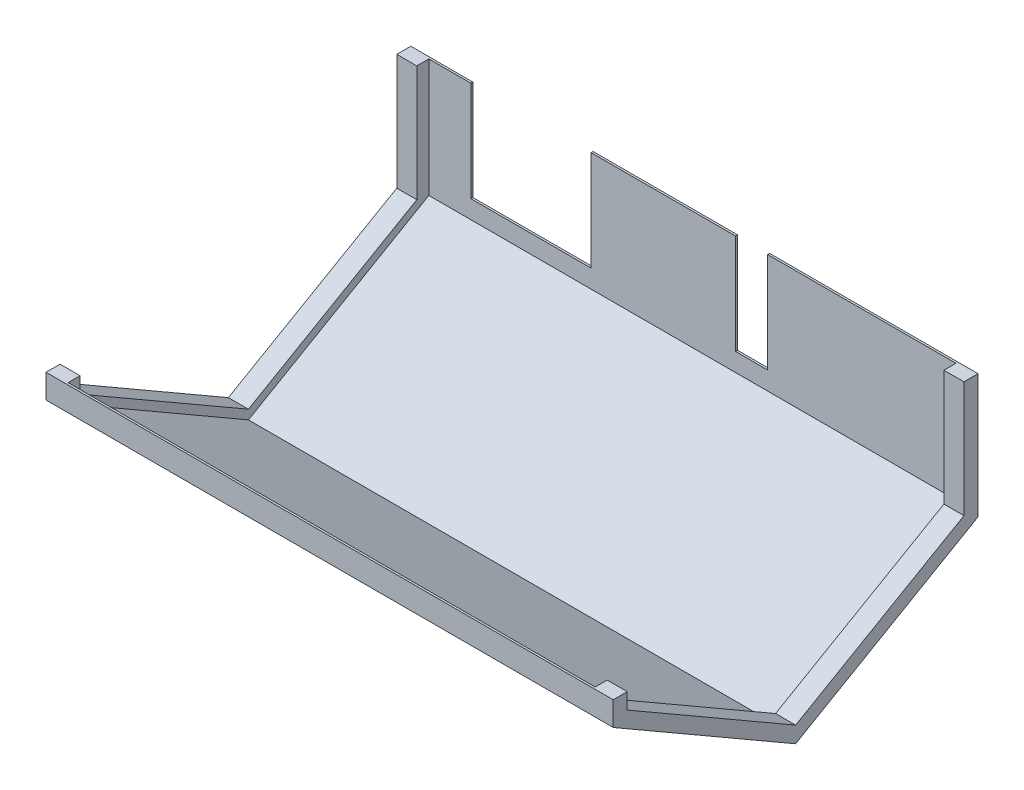
ISO-10303-21;
HEADER;
FILE_DESCRIPTION(('STEP AP214'),'2;1');
FILE_NAME('part.step','',(''),(''),'','','');
FILE_SCHEMA(('AUTOMOTIVE_DESIGN { 1 0 10303 214 1 1 1 1 }'));
ENDSEC;
DATA;
#1=APPLICATION_CONTEXT('core data for automotive mechanical design processes');
#2=APPLICATION_PROTOCOL_DEFINITION('international standard','automotive_design',2000,#1);
#3=PRODUCT_CONTEXT('',#1,'mechanical');
#4=PRODUCT('Part','Part','',(#3));
#5=PRODUCT_RELATED_PRODUCT_CATEGORY('part','',(#4));
#6=PRODUCT_DEFINITION_FORMATION('','',#4);
#7=PRODUCT_DEFINITION_CONTEXT('part definition',#1,'design');
#8=PRODUCT_DEFINITION('design','',#6,#7);
#9=PRODUCT_DEFINITION_SHAPE('','',#8);
#10=(LENGTH_UNIT() NAMED_UNIT(*) SI_UNIT(.MILLI.,.METRE.));
#11=(NAMED_UNIT(*) PLANE_ANGLE_UNIT() SI_UNIT($,.RADIAN.));
#12=(NAMED_UNIT(*) SI_UNIT($,.STERADIAN.) SOLID_ANGLE_UNIT());
#13=UNCERTAINTY_MEASURE_WITH_UNIT(LENGTH_MEASURE(1.E-05),#10,'distance_accuracy_value','');
#14=(GEOMETRIC_REPRESENTATION_CONTEXT(3) GLOBAL_UNCERTAINTY_ASSIGNED_CONTEXT((#13)) GLOBAL_UNIT_ASSIGNED_CONTEXT((#10,
#11,#12)) REPRESENTATION_CONTEXT('',''));
#15=CARTESIAN_POINT('',(0.,0.,0.));
#16=DIRECTION('',(0.,0.,1.));
#17=DIRECTION('',(1.,0.,0.));
#18=AXIS2_PLACEMENT_3D('',#15,#16,#17);
#19=CARTESIAN_POINT('',(-23899.0957584092,2750.,-9050.));
#20=DIRECTION('',(0.,1.,0.));
#21=DIRECTION('',(0.,0.,1.));
#22=AXIS2_PLACEMENT_3D('',#19,#20,#21);
#23=PLANE('',#22);
#24=DIRECTION('',(0.,0.,1.));
#25=VECTOR('',#24,1.);
#26=CARTESIAN_POINT('',(-5500.,2750.,-9050.));
#27=LINE('',#26,#25);
#28=CARTESIAN_POINT('',(-5500.,2750.,-9050.));
#29=VERTEX_POINT('',#28);
#30=CARTESIAN_POINT('',(-5500.,2750.,-9000.));
#31=VERTEX_POINT('',#30);
#32=EDGE_CURVE('E432',#29,#31,#27,.T.);
#33=ORIENTED_EDGE('',*,*,#32,.F.);
#34=DIRECTION('',(1.,0.,0.));
#35=VECTOR('',#34,1.);
#36=CARTESIAN_POINT('',(-23899.0957584092,2750.,-9050.));
#37=LINE('',#36,#35);
#38=CARTESIAN_POINT('',(-9100.,2750.,-9050.));
#39=VERTEX_POINT('',#38);
#40=EDGE_CURVE('E378',#39,#29,#37,.T.);
#41=ORIENTED_EDGE('',*,*,#40,.F.);
#42=DIRECTION('',(0.,0.,-1.));
#43=VECTOR('',#42,1.);
#44=CARTESIAN_POINT('',(-9100.,2750.,-9050.));
#45=LINE('',#44,#43);
#46=CARTESIAN_POINT('',(-9100.,2750.,-9000.));
#47=VERTEX_POINT('',#46);
#48=EDGE_CURVE('E424',#47,#39,#45,.T.);
#49=ORIENTED_EDGE('',*,*,#48,.F.);
#50=DIRECTION('',(1.,0.,0.));
#51=VECTOR('',#50,1.);
#52=CARTESIAN_POINT('',(-23899.0957584092,2750.,-9000.));
#53=LINE('',#52,#51);
#54=EDGE_CURVE('E373',#47,#31,#53,.T.);
#55=ORIENTED_EDGE('',*,*,#54,.T.);
#56=EDGE_LOOP('',(#33,#41,#49,#55));
#57=FACE_BOUND('',#56,.T.);
#58=ADVANCED_FACE('F41',(#57),#23,.T.);
#59=DIRECTION('',(0.,0.,-1.));
#60=VECTOR('',#59,1.);
#61=CARTESIAN_POINT('',(-4700.,2750.,-9050.));
#62=LINE('',#61,#60);
#63=CARTESIAN_POINT('',(-4700.,2750.,-9000.));
#64=VERTEX_POINT('',#63);
#65=CARTESIAN_POINT('',(-4700.,2750.,-9050.));
#66=VERTEX_POINT('',#65);
#67=EDGE_CURVE('E392',#64,#66,#62,.T.);
#68=ORIENTED_EDGE('',*,*,#67,.F.);
#69=CARTESIAN_POINT('',(0.,2750.,-9000.));
#70=VERTEX_POINT('',#69);
#71=EDGE_CURVE('E374',#64,#70,#53,.T.);
#72=ORIENTED_EDGE('',*,*,#71,.T.);
#73=DIRECTION('',(0.,0.,1.));
#74=VECTOR('',#73,1.);
#75=CARTESIAN_POINT('',(0.,2750.,-9050.));
#76=LINE('',#75,#74);
#77=CARTESIAN_POINT('',(0.,2750.,-8700.));
#78=VERTEX_POINT('',#77);
#79=EDGE_CURVE('E287',#70,#78,#76,.T.);
#80=ORIENTED_EDGE('',*,*,#79,.T.);
#81=DIRECTION('',(-1.,0.,0.));
#82=VECTOR('',#81,1.);
#83=CARTESIAN_POINT('',(500.,2750.,-8700.));
#84=LINE('',#83,#82);
#85=CARTESIAN_POINT('',(500.,2750.,-8700.));
#86=VERTEX_POINT('',#85);
#87=EDGE_CURVE('E334',#86,#78,#84,.T.);
#88=ORIENTED_EDGE('',*,*,#87,.F.);
#89=DIRECTION('',(0.,0.,1.));
#90=VECTOR('',#89,1.);
#91=CARTESIAN_POINT('',(500.,2750.,-9050.));
#92=LINE('',#91,#90);
#93=CARTESIAN_POINT('',(500.,2750.,-9050.));
#94=VERTEX_POINT('',#93);
#95=EDGE_CURVE('E301',#94,#86,#92,.T.);
#96=ORIENTED_EDGE('',*,*,#95,.F.);
#97=EDGE_CURVE('E379',#66,#94,#37,.T.);
#98=ORIENTED_EDGE('',*,*,#97,.F.);
#99=EDGE_LOOP('',(#68,#72,#80,#88,#96,#98));
#100=FACE_BOUND('',#99,.T.);
#101=ADVANCED_FACE('F446',(#100),#23,.T.);
#102=CARTESIAN_POINT('',(-23899.0957584092,-2971.28129211017,-4500.));
#103=DIRECTION('',(0.,-0.866025403784442,0.499999999999994));
#104=DIRECTION('',(0.,-0.499999999999994,-0.866025403784442));
#105=AXIS2_PLACEMENT_3D('',#102,#103,#104);
#106=PLANE('',#105);
#107=DIRECTION('',(1.,0.,0.));
#108=VECTOR('',#107,1.);
#109=CARTESIAN_POINT('',(-23899.0957584092,-344.337567297407,50.0000000000025));
#110=LINE('',#109,#108);
#111=CARTESIAN_POINT('',(-13650.,-344.337567297406,50.0000000000025));
#112=VERTEX_POINT('',#111);
#113=CARTESIAN_POINT('',(500.,-344.337567297407,50.0000000000025));
#114=VERTEX_POINT('',#113);
#115=EDGE_CURVE('E342',#112,#114,#110,.T.);
#116=ORIENTED_EDGE('',*,*,#115,.F.);
#117=DIRECTION('',(0.,-0.499999999999995,-0.866025403784442));
#118=VECTOR('',#117,1.);
#119=CARTESIAN_POINT('',(-13650.,-3489.51812759763,-5397.61252941802));
#120=LINE('',#119,#118);
#121=CARTESIAN_POINT('',(-13650.,-2971.28129211017,-4500.));
#122=VERTEX_POINT('',#121);
#123=EDGE_CURVE('E243',#112,#122,#120,.T.);
#124=ORIENTED_EDGE('',*,*,#123,.T.);
#125=DIRECTION('',(1.,0.,0.));
#126=VECTOR('',#125,1.);
#127=CARTESIAN_POINT('',(-23899.0957584092,-2971.28129211017,-4500.));
#128=LINE('',#127,#126);
#129=CARTESIAN_POINT('',(500.,-2971.28129211017,-4500.));
#130=VERTEX_POINT('',#129);
#131=EDGE_CURVE('E362',#122,#130,#128,.T.);
#132=ORIENTED_EDGE('',*,*,#131,.T.);
#133=DIRECTION('',(0.,-0.499999999999995,-0.866025403784442));
#134=VECTOR('',#133,1.);
#135=CARTESIAN_POINT('',(500.,-344.337567297407,50.0000000000025));
#136=LINE('',#135,#134);
#137=EDGE_CURVE('E313',#114,#130,#136,.T.);
#138=ORIENTED_EDGE('',*,*,#137,.F.);
#139=EDGE_LOOP('',(#116,#124,#132,#138));
#140=FACE_BOUND('',#139,.T.);
#141=ADVANCED_FACE('F43',(#140),#106,.T.);
#142=CARTESIAN_POINT('',(-23899.0957584092,-344.337567297407,50.0000000000025));
#143=DIRECTION('',(0.,0.,1.));
#144=DIRECTION('',(1.,0.,0.));
#145=AXIS2_PLACEMENT_3D('',#142,#143,#144);
#146=PLANE('',#145);
#147=DIRECTION('',(1.,0.,0.));
#148=VECTOR('',#147,1.);
#149=CARTESIAN_POINT('',(-14440.1640773263,255.662432702594,50.0000000000025));
#150=LINE('',#149,#148);
#151=CARTESIAN_POINT('',(-13650.,255.662432702594,50.0000000000025));
#152=VERTEX_POINT('',#151);
#153=CARTESIAN_POINT('',(499.999999999996,255.662432702594,50.0000000000025));
#154=VERTEX_POINT('',#153);
#155=EDGE_CURVE('E225',#152,#154,#150,.T.);
#156=ORIENTED_EDGE('',*,*,#155,.F.);
#157=DIRECTION('',(0.,-1.,0.));
#158=VECTOR('',#157,1.);
#159=CARTESIAN_POINT('',(-13650.,2750.,50.0000000000025));
#160=LINE('',#159,#158);
#161=EDGE_CURVE('E235',#152,#112,#160,.T.);
#162=ORIENTED_EDGE('',*,*,#161,.T.);
#163=ORIENTED_EDGE('',*,*,#115,.T.);
#164=DIRECTION('',(0.,-1.,0.));
#165=VECTOR('',#164,1.);
#166=CARTESIAN_POINT('',(500.,2750.,50.0000000000025));
#167=LINE('',#166,#165);
#168=EDGE_CURVE('E237',#154,#114,#167,.T.);
#169=ORIENTED_EDGE('',*,*,#168,.F.);
#170=EDGE_LOOP('',(#156,#162,#163,#169));
#171=FACE_BOUND('',#170,.T.);
#172=ADVANCED_FACE('F233',(#171),#146,.T.);
#173=CARTESIAN_POINT('',(-23899.0957584092,2750.,1.77635683940025E-12));
#174=DIRECTION('',(0.,0.,-1.));
#175=DIRECTION('',(-1.,0.,0.));
#176=AXIS2_PLACEMENT_3D('',#173,#174,#175);
#177=PLANE('',#176);
#178=DIRECTION('',(-1.,0.,0.));
#179=VECTOR('',#178,1.);
#180=CARTESIAN_POINT('',(-23899.0957584092,255.662432702594,1.77635683940025E-12));
#181=LINE('',#180,#179);
#182=CARTESIAN_POINT('',(0.,255.662432702594,1.77635683940025E-12));
#183=VERTEX_POINT('',#182);
#184=CARTESIAN_POINT('',(-13150.,255.662432702594,1.77635684101785E-12));
#185=VERTEX_POINT('',#184);
#186=EDGE_CURVE('E507',#183,#185,#181,.T.);
#187=ORIENTED_EDGE('',*,*,#186,.F.);
#188=DIRECTION('',(0.,1.,0.));
#189=VECTOR('',#188,1.);
#190=CARTESIAN_POINT('',(0.,2750.,1.77635683940025E-12));
#191=LINE('',#190,#189);
#192=CARTESIAN_POINT('',(0.,-200.000000000001,1.77635683940025E-12));
#193=VERTEX_POINT('',#192);
#194=EDGE_CURVE('E359',#193,#183,#191,.T.);
#195=ORIENTED_EDGE('',*,*,#194,.F.);
#196=DIRECTION('',(1.,0.,0.));
#197=VECTOR('',#196,1.);
#198=CARTESIAN_POINT('',(-23899.0957584092,-200.000000000001,1.77635683940025E-12));
#199=LINE('',#198,#197);
#200=CARTESIAN_POINT('',(-13150.,-200.000000000001,1.77635684012796E-12));
#201=VERTEX_POINT('',#200);
#202=EDGE_CURVE('E364',#201,#193,#199,.T.);
#203=ORIENTED_EDGE('',*,*,#202,.F.);
#204=DIRECTION('',(0.,-1.,0.));
#205=VECTOR('',#204,1.);
#206=CARTESIAN_POINT('',(-13150.,2750.,1.77635683940025E-12));
#207=LINE('',#206,#205);
#208=EDGE_CURVE('E348',#185,#201,#207,.T.);
#209=ORIENTED_EDGE('',*,*,#208,.F.);
#210=EDGE_LOOP('',(#187,#195,#203,#209));
#211=FACE_BOUND('',#210,.T.);
#212=ADVANCED_FACE('F518',(#211),#177,.T.);
#213=CARTESIAN_POINT('',(-23899.0957584092,-200.000000000001,1.77635683940025E-12));
#214=DIRECTION('',(0.,0.866025403784442,-0.499999999999994));
#215=DIRECTION('',(0.,0.499999999999994,0.866025403784442));
#216=AXIS2_PLACEMENT_3D('',#213,#214,#215);
#217=PLANE('',#216);
#218=DIRECTION('',(0.,-0.499999999999994,-0.866025403784442));
#219=VECTOR('',#218,1.);
#220=CARTESIAN_POINT('',(-13150.,-199.999999999999,4.95872846737E-12));
#221=LINE('',#220,#219);
#222=CARTESIAN_POINT('',(-13150.,-2798.07621135328,-4500.));
#223=VERTEX_POINT('',#222);
#224=EDGE_CURVE('E345',#201,#223,#221,.T.);
#225=ORIENTED_EDGE('',*,*,#224,.F.);
#226=ORIENTED_EDGE('',*,*,#202,.T.);
#227=DIRECTION('',(0.,0.499999999999994,0.866025403784442));
#228=VECTOR('',#227,1.);
#229=CARTESIAN_POINT('',(0.,-200.000000000001,1.77635683940025E-12));
#230=LINE('',#229,#228);
#231=CARTESIAN_POINT('',(0.,-2798.07621135328,-4500.));
#232=VERTEX_POINT('',#231);
#233=EDGE_CURVE('E356',#232,#193,#230,.T.);
#234=ORIENTED_EDGE('',*,*,#233,.F.);
#235=DIRECTION('',(1.,0.,0.));
#236=VECTOR('',#235,1.);
#237=CARTESIAN_POINT('',(-23899.0957584092,-2798.07621135328,-4500.));
#238=LINE('',#237,#236);
#239=EDGE_CURVE('E366',#223,#232,#238,.T.);
#240=ORIENTED_EDGE('',*,*,#239,.F.);
#241=EDGE_LOOP('',(#225,#226,#234,#240));
#242=FACE_BOUND('',#241,.T.);
#243=ADVANCED_FACE('F521',(#242),#217,.T.);
#244=CARTESIAN_POINT('',(-23899.0957584092,-200.,-9000.));
#245=DIRECTION('',(0.,0.866025403784441,0.499999999999996));
#246=DIRECTION('',(0.,-0.499999999999996,0.866025403784441));
#247=AXIS2_PLACEMENT_3D('',#244,#245,#246);
#248=PLANE('',#247);
#249=DIRECTION('',(0.,0.499999999999996,-0.866025403784441));
#250=VECTOR('',#249,1.);
#251=CARTESIAN_POINT('',(-13150.,-200.000000000002,-8999.99999999999));
#252=LINE('',#251,#250);
#253=CARTESIAN_POINT('',(-13150.,-200.,-9000.));
#254=VERTEX_POINT('',#253);
#255=EDGE_CURVE('E341',#223,#254,#252,.T.);
#256=ORIENTED_EDGE('',*,*,#255,.F.);
#257=ORIENTED_EDGE('',*,*,#239,.T.);
#258=DIRECTION('',(0.,-0.499999999999995,0.866025403784441));
#259=VECTOR('',#258,1.);
#260=CARTESIAN_POINT('',(0.,-200.,-9000.));
#261=LINE('',#260,#259);
#262=CARTESIAN_POINT('',(0.,-200.,-9000.));
#263=VERTEX_POINT('',#262);
#264=EDGE_CURVE('E353',#263,#232,#261,.T.);
#265=ORIENTED_EDGE('',*,*,#264,.F.);
#266=DIRECTION('',(1.,0.,0.));
#267=VECTOR('',#266,1.);
#268=CARTESIAN_POINT('',(-23899.0957584092,-200.,-9000.));
#269=LINE('',#268,#267);
#270=EDGE_CURVE('E368',#254,#263,#269,.T.);
#271=ORIENTED_EDGE('',*,*,#270,.F.);
#272=EDGE_LOOP('',(#256,#257,#265,#271));
#273=FACE_BOUND('',#272,.T.);
#274=ADVANCED_FACE('F475',(#273),#248,.T.);
#275=CARTESIAN_POINT('',(-23899.0957584092,2750.,-9000.));
#276=DIRECTION('',(0.,0.,1.));
#277=DIRECTION('',(1.,0.,0.));
#278=AXIS2_PLACEMENT_3D('',#275,#276,#277);
#279=PLANE('',#278);
#280=DIRECTION('',(0.,-1.,0.));
#281=VECTOR('',#280,1.);
#282=CARTESIAN_POINT('',(-5500.,2750.,-9000.));
#283=LINE('',#282,#281);
#284=CARTESIAN_POINT('',(-5500.,255.662432702609,-9000.));
#285=VERTEX_POINT('',#284);
#286=EDGE_CURVE('E252',#31,#285,#283,.T.);
#287=ORIENTED_EDGE('',*,*,#286,.F.);
#288=ORIENTED_EDGE('',*,*,#54,.F.);
#289=DIRECTION('',(0.,1.,0.));
#290=VECTOR('',#289,1.);
#291=CARTESIAN_POINT('',(-9100.,2750.,-9000.));
#292=LINE('',#291,#290);
#293=CARTESIAN_POINT('',(-9100.,255.662432702609,-9000.));
#294=VERTEX_POINT('',#293);
#295=EDGE_CURVE('E426',#294,#47,#292,.T.);
#296=ORIENTED_EDGE('',*,*,#295,.F.);
#297=DIRECTION('',(1.,0.,0.));
#298=VECTOR('',#297,1.);
#299=CARTESIAN_POINT('',(-23899.0957584092,255.66243270261,-9000.));
#300=LINE('',#299,#298);
#301=CARTESIAN_POINT('',(-12100.,255.662432702609,-9000.));
#302=VERTEX_POINT('',#301);
#303=EDGE_CURVE('E410',#302,#294,#300,.T.);
#304=ORIENTED_EDGE('',*,*,#303,.F.);
#305=DIRECTION('',(0.,-1.,0.));
#306=VECTOR('',#305,1.);
#307=CARTESIAN_POINT('',(-12100.,2750.,-9000.));
#308=LINE('',#307,#306);
#309=CARTESIAN_POINT('',(-12100.,2750.,-9000.));
#310=VERTEX_POINT('',#309);
#311=EDGE_CURVE('E422',#310,#302,#308,.T.);
#312=ORIENTED_EDGE('',*,*,#311,.F.);
#313=CARTESIAN_POINT('',(-13150.,2750.,-9000.));
#314=VERTEX_POINT('',#313);
#315=EDGE_CURVE('E370',#314,#310,#53,.T.);
#316=ORIENTED_EDGE('',*,*,#315,.F.);
#317=DIRECTION('',(0.,1.,0.));
#318=VECTOR('',#317,1.);
#319=CARTESIAN_POINT('',(-13150.,2750.,-9000.));
#320=LINE('',#319,#318);
#321=EDGE_CURVE('E338',#254,#314,#320,.T.);
#322=ORIENTED_EDGE('',*,*,#321,.F.);
#323=ORIENTED_EDGE('',*,*,#270,.T.);
#324=DIRECTION('',(0.,-1.,0.));
#325=VECTOR('',#324,1.);
#326=CARTESIAN_POINT('',(0.,2750.,-9000.));
#327=LINE('',#326,#325);
#328=EDGE_CURVE('E337',#70,#263,#327,.T.);
#329=ORIENTED_EDGE('',*,*,#328,.F.);
#330=ORIENTED_EDGE('',*,*,#71,.F.);
#331=DIRECTION('',(0.,1.,0.));
#332=VECTOR('',#331,1.);
#333=CARTESIAN_POINT('',(-4700.,2750.,-9000.));
#334=LINE('',#333,#332);
#335=CARTESIAN_POINT('',(-4700.,255.662432702609,-9000.));
#336=VERTEX_POINT('',#335);
#337=EDGE_CURVE('E429',#336,#64,#334,.T.);
#338=ORIENTED_EDGE('',*,*,#337,.F.);
#339=DIRECTION('',(1.,0.,0.));
#340=VECTOR('',#339,1.);
#341=CARTESIAN_POINT('',(-23899.0957584092,255.662432702612,-9000.));
#342=LINE('',#341,#340);
#343=EDGE_CURVE('E431',#285,#336,#342,.T.);
#344=ORIENTED_EDGE('',*,*,#343,.F.);
#345=EDGE_LOOP('',(#287,#288,#296,#304,#312,#316,#322,#323,#329,#330,#338,#344));
#346=FACE_BOUND('',#345,.T.);
#347=ADVANCED_FACE('F442',(#346),#279,.T.);
#348=DIRECTION('',(0.,0.,1.));
#349=VECTOR('',#348,1.);
#350=CARTESIAN_POINT('',(-12100.,2750.,-9050.));
#351=LINE('',#350,#349);
#352=CARTESIAN_POINT('',(-12100.,2750.,-9050.));
#353=VERTEX_POINT('',#352);
#354=EDGE_CURVE('E420',#353,#310,#351,.T.);
#355=ORIENTED_EDGE('',*,*,#354,.F.);
#356=CARTESIAN_POINT('',(-13650.,2750.,-9050.));
#357=VERTEX_POINT('',#356);
#358=EDGE_CURVE('E375',#357,#353,#37,.T.);
#359=ORIENTED_EDGE('',*,*,#358,.F.);
#360=DIRECTION('',(0.,0.,1.));
#361=VECTOR('',#360,1.);
#362=CARTESIAN_POINT('',(-13650.,2750.,-9000.00000000001));
#363=LINE('',#362,#361);
#364=CARTESIAN_POINT('',(-13650.,2750.,-8700.));
#365=VERTEX_POINT('',#364);
#366=EDGE_CURVE('E260',#357,#365,#363,.T.);
#367=ORIENTED_EDGE('',*,*,#366,.T.);
#368=DIRECTION('',(1.,0.,0.));
#369=VECTOR('',#368,1.);
#370=CARTESIAN_POINT('',(-13650.,2750.,-8700.));
#371=LINE('',#370,#369);
#372=CARTESIAN_POINT('',(-13150.,2750.,-8700.));
#373=VERTEX_POINT('',#372);
#374=EDGE_CURVE('E274',#365,#373,#371,.T.);
#375=ORIENTED_EDGE('',*,*,#374,.T.);
#376=DIRECTION('',(0.,0.,1.));
#377=VECTOR('',#376,1.);
#378=CARTESIAN_POINT('',(-13150.,2750.,-9000.00000000001));
#379=LINE('',#378,#377);
#380=EDGE_CURVE('E275',#314,#373,#379,.T.);
#381=ORIENTED_EDGE('',*,*,#380,.F.);
#382=ORIENTED_EDGE('',*,*,#315,.T.);
#383=EDGE_LOOP('',(#355,#359,#367,#375,#381,#382));
#384=FACE_BOUND('',#383,.T.);
#385=ADVANCED_FACE('F468',(#384),#23,.T.);
#386=CARTESIAN_POINT('',(-23899.0957584092,-344.337567297406,-9050.));
#387=DIRECTION('',(0.,0.,-1.));
#388=DIRECTION('',(0.,1.,0.));
#389=AXIS2_PLACEMENT_3D('',#386,#387,#388);
#390=PLANE('',#389);
#391=DIRECTION('',(0.,1.,0.));
#392=VECTOR('',#391,1.);
#393=CARTESIAN_POINT('',(-5500.,255.662432702609,-9050.));
#394=LINE('',#393,#392);
#395=CARTESIAN_POINT('',(-5500.,255.662432702609,-9050.));
#396=VERTEX_POINT('',#395);
#397=EDGE_CURVE('E400',#396,#29,#394,.T.);
#398=ORIENTED_EDGE('',*,*,#397,.F.);
#399=DIRECTION('',(-1.,0.,0.));
#400=VECTOR('',#399,1.);
#401=CARTESIAN_POINT('',(-5500.,255.662432702609,-9050.));
#402=LINE('',#401,#400);
#403=CARTESIAN_POINT('',(-4700.,255.662432702609,-9050.));
#404=VERTEX_POINT('',#403);
#405=EDGE_CURVE('E397',#404,#396,#402,.T.);
#406=ORIENTED_EDGE('',*,*,#405,.F.);
#407=DIRECTION('',(0.,-1.,0.));
#408=VECTOR('',#407,1.);
#409=CARTESIAN_POINT('',(-4700.,-344.337567297406,-9050.));
#410=LINE('',#409,#408);
#411=EDGE_CURVE('E49',#66,#404,#410,.T.);
#412=ORIENTED_EDGE('',*,*,#411,.F.);
#413=ORIENTED_EDGE('',*,*,#97,.T.);
#414=DIRECTION('',(0.,1.,0.));
#415=VECTOR('',#414,1.);
#416=CARTESIAN_POINT('',(500.,2750.,-9050.));
#417=LINE('',#416,#415);
#418=CARTESIAN_POINT('',(500.,-344.337567297407,-9050.));
#419=VERTEX_POINT('',#418);
#420=EDGE_CURVE('E297',#419,#94,#417,.T.);
#421=ORIENTED_EDGE('',*,*,#420,.F.);
#422=DIRECTION('',(1.,0.,0.));
#423=VECTOR('',#422,1.);
#424=CARTESIAN_POINT('',(-23899.0957584092,-344.337567297406,-9050.));
#425=LINE('',#424,#423);
#426=CARTESIAN_POINT('',(-13650.,-344.337567297407,-9050.));
#427=VERTEX_POINT('',#426);
#428=EDGE_CURVE('E380',#427,#419,#425,.T.);
#429=ORIENTED_EDGE('',*,*,#428,.F.);
#430=DIRECTION('',(0.,1.,0.));
#431=VECTOR('',#430,1.);
#432=CARTESIAN_POINT('',(-13650.,2750.,-9050.));
#433=LINE('',#432,#431);
#434=EDGE_CURVE('E257',#427,#357,#433,.T.);
#435=ORIENTED_EDGE('',*,*,#434,.T.);
#436=ORIENTED_EDGE('',*,*,#358,.T.);
#437=DIRECTION('',(0.,1.,0.));
#438=VECTOR('',#437,1.);
#439=CARTESIAN_POINT('',(-12100.,2984.08046371061,-9050.));
#440=LINE('',#439,#438);
#441=CARTESIAN_POINT('',(-12100.,255.662432702609,-9050.));
#442=VERTEX_POINT('',#441);
#443=EDGE_CURVE('E413',#442,#353,#440,.T.);
#444=ORIENTED_EDGE('',*,*,#443,.F.);
#445=DIRECTION('',(-1.,0.,0.));
#446=VECTOR('',#445,1.);
#447=CARTESIAN_POINT('',(-9100.,255.662432702609,-9050.));
#448=LINE('',#447,#446);
#449=CARTESIAN_POINT('',(-9100.,255.662432702609,-9050.));
#450=VERTEX_POINT('',#449);
#451=EDGE_CURVE('E406',#450,#442,#448,.T.);
#452=ORIENTED_EDGE('',*,*,#451,.F.);
#453=DIRECTION('',(0.,-1.,0.));
#454=VECTOR('',#453,1.);
#455=CARTESIAN_POINT('',(-9100.,-344.337567297406,-9050.));
#456=LINE('',#455,#454);
#457=EDGE_CURVE('E350',#39,#450,#456,.T.);
#458=ORIENTED_EDGE('',*,*,#457,.F.);
#459=ORIENTED_EDGE('',*,*,#40,.T.);
#460=EDGE_LOOP('',(#398,#406,#412,#413,#421,#429,#435,#436,#444,#452,#458,#459));
#461=FACE_BOUND('',#460,.T.);
#462=ADVANCED_FACE('F398',(#461),#390,.T.);
#463=CARTESIAN_POINT('',(-23899.0957584092,-2971.28129211017,-4500.));
#464=DIRECTION('',(0.,-0.866025403784441,-0.499999999999995));
#465=DIRECTION('',(0.,0.499999999999995,-0.866025403784442));
#466=AXIS2_PLACEMENT_3D('',#463,#464,#465);
#467=PLANE('',#466);
#468=ORIENTED_EDGE('',*,*,#131,.F.);
#469=DIRECTION('',(0.,0.499999999999995,-0.866025403784442));
#470=VECTOR('',#469,1.);
#471=CARTESIAN_POINT('',(-13650.,407.596189432322,-10352.387470582));
#472=LINE('',#471,#470);
#473=EDGE_CURVE('E246',#122,#427,#472,.T.);
#474=ORIENTED_EDGE('',*,*,#473,.T.);
#475=ORIENTED_EDGE('',*,*,#428,.T.);
#476=DIRECTION('',(0.,0.499999999999995,-0.866025403784442));
#477=VECTOR('',#476,1.);
#478=CARTESIAN_POINT('',(500.,-344.337567297407,-9050.));
#479=LINE('',#478,#477);
#480=EDGE_CURVE('E294',#130,#419,#479,.T.);
#481=ORIENTED_EDGE('',*,*,#480,.F.);
#482=EDGE_LOOP('',(#468,#474,#475,#481));
#483=FACE_BOUND('',#482,.T.);
#484=ADVANCED_FACE('F496',(#483),#467,.T.);
#485=CARTESIAN_POINT('',(0.,0.,0.));
#486=DIRECTION('',(1.,0.,0.));
#487=DIRECTION('',(0.,0.,-1.));
#488=AXIS2_PLACEMENT_3D('',#485,#486,#487);
#489=PLANE('',#488);
#490=ORIENTED_EDGE('',*,*,#194,.T.);
#491=DIRECTION('',(0.,0.,-1.));
#492=VECTOR('',#491,1.);
#493=CARTESIAN_POINT('',(0.,255.662432702594,0.));
#494=LINE('',#493,#492);
#495=CARTESIAN_POINT('',(0.,255.662432702594,-299.999999999998));
#496=VERTEX_POINT('',#495);
#497=EDGE_CURVE('E502',#183,#496,#494,.T.);
#498=ORIENTED_EDGE('',*,*,#497,.T.);
#499=DIRECTION('',(0.,1.,0.));
#500=VECTOR('',#499,1.);
#501=CARTESIAN_POINT('',(0.,2750.,-299.999999999997));
#502=LINE('',#501,#500);
#503=CARTESIAN_POINT('',(0.,-142.264973081036,-299.999999999998));
#504=VERTEX_POINT('',#503);
#505=EDGE_CURVE('E298',#504,#496,#502,.T.);
#506=ORIENTED_EDGE('',*,*,#505,.F.);
#507=DIRECTION('',(0.,0.499999999999994,0.866025403784442));
#508=VECTOR('',#507,1.);
#509=CARTESIAN_POINT('',(0.,-142.264973081036,-299.999999999998));
#510=LINE('',#509,#508);
#511=CARTESIAN_POINT('',(0.,-2567.13610367743,-4500.));
#512=VERTEX_POINT('',#511);
#513=EDGE_CURVE('E322',#512,#504,#510,.T.);
#514=ORIENTED_EDGE('',*,*,#513,.F.);
#515=DIRECTION('',(0.,-0.499999999999995,0.866025403784441));
#516=VECTOR('',#515,1.);
#517=CARTESIAN_POINT('',(0.,-142.264973081037,-8700.));
#518=LINE('',#517,#516);
#519=CARTESIAN_POINT('',(0.,-142.264973081037,-8700.));
#520=VERTEX_POINT('',#519);
#521=EDGE_CURVE('E320',#520,#512,#518,.T.);
#522=ORIENTED_EDGE('',*,*,#521,.F.);
#523=DIRECTION('',(0.,-1.,0.));
#524=VECTOR('',#523,1.);
#525=CARTESIAN_POINT('',(0.,2750.,-8700.));
#526=LINE('',#525,#524);
#527=EDGE_CURVE('E318',#78,#520,#526,.T.);
#528=ORIENTED_EDGE('',*,*,#527,.F.);
#529=ORIENTED_EDGE('',*,*,#79,.F.);
#530=ORIENTED_EDGE('',*,*,#328,.T.);
#531=ORIENTED_EDGE('',*,*,#264,.T.);
#532=ORIENTED_EDGE('',*,*,#233,.T.);
#533=EDGE_LOOP('',(#490,#498,#506,#514,#522,#528,#529,#530,#531,#532));
#534=FACE_BOUND('',#533,.T.);
#535=ADVANCED_FACE('F480',(#534),#489,.F.);
#536=CARTESIAN_POINT('',(500.,2750.,-8700.));
#537=DIRECTION('',(0.,0.,-1.));
#538=DIRECTION('',(0.,1.,0.));
#539=AXIS2_PLACEMENT_3D('',#536,#537,#538);
#540=PLANE('',#539);
#541=ORIENTED_EDGE('',*,*,#527,.T.);
#542=DIRECTION('',(-1.,0.,0.));
#543=VECTOR('',#542,1.);
#544=CARTESIAN_POINT('',(500.,-142.264973081037,-8700.));
#545=LINE('',#544,#543);
#546=CARTESIAN_POINT('',(500.,-142.264973081037,-8700.));
#547=VERTEX_POINT('',#546);
#548=EDGE_CURVE('E331',#547,#520,#545,.T.);
#549=ORIENTED_EDGE('',*,*,#548,.F.);
#550=DIRECTION('',(0.,-1.,0.));
#551=VECTOR('',#550,1.);
#552=CARTESIAN_POINT('',(500.,2750.,-8700.));
#553=LINE('',#552,#551);
#554=EDGE_CURVE('E303',#86,#547,#553,.T.);
#555=ORIENTED_EDGE('',*,*,#554,.F.);
#556=ORIENTED_EDGE('',*,*,#87,.T.);
#557=EDGE_LOOP('',(#541,#549,#555,#556));
#558=FACE_BOUND('',#557,.T.);
#559=ADVANCED_FACE('F485',(#558),#540,.F.);
#560=CARTESIAN_POINT('',(500.,-142.264973081037,-8700.));
#561=DIRECTION('',(0.,-0.866025403784441,-0.499999999999995));
#562=DIRECTION('',(0.,0.499999999999995,-0.866025403784441));
#563=AXIS2_PLACEMENT_3D('',#560,#561,#562);
#564=PLANE('',#563);
#565=ORIENTED_EDGE('',*,*,#521,.T.);
#566=DIRECTION('',(-1.,0.,0.));
#567=VECTOR('',#566,1.);
#568=CARTESIAN_POINT('',(500.,-2567.13610367743,-4500.));
#569=LINE('',#568,#567);
#570=CARTESIAN_POINT('',(500.,-2567.13610367743,-4500.));
#571=VERTEX_POINT('',#570);
#572=EDGE_CURVE('E328',#571,#512,#569,.T.);
#573=ORIENTED_EDGE('',*,*,#572,.F.);
#574=DIRECTION('',(0.,-0.499999999999995,0.866025403784441));
#575=VECTOR('',#574,1.);
#576=CARTESIAN_POINT('',(500.,-142.264973081037,-8700.));
#577=LINE('',#576,#575);
#578=EDGE_CURVE('E305',#547,#571,#577,.T.);
#579=ORIENTED_EDGE('',*,*,#578,.F.);
#580=ORIENTED_EDGE('',*,*,#548,.T.);
#581=EDGE_LOOP('',(#565,#573,#579,#580));
#582=FACE_BOUND('',#581,.T.);
#583=ADVANCED_FACE('F531',(#582),#564,.F.);
#584=CARTESIAN_POINT('',(500.,-142.264973081036,-299.999999999998));
#585=DIRECTION('',(0.,-0.866025403784442,0.499999999999994));
#586=DIRECTION('',(0.,-0.499999999999994,-0.866025403784442));
#587=AXIS2_PLACEMENT_3D('',#584,#585,#586);
#588=PLANE('',#587);
#589=ORIENTED_EDGE('',*,*,#513,.T.);
#590=DIRECTION('',(-1.,0.,0.));
#591=VECTOR('',#590,1.);
#592=CARTESIAN_POINT('',(500.,-142.264973081036,-299.999999999998));
#593=LINE('',#592,#591);
#594=CARTESIAN_POINT('',(500.,-142.264973081036,-299.999999999998));
#595=VERTEX_POINT('',#594);
#596=EDGE_CURVE('E316',#595,#504,#593,.T.);
#597=ORIENTED_EDGE('',*,*,#596,.F.);
#598=DIRECTION('',(0.,0.499999999999994,0.866025403784442));
#599=VECTOR('',#598,1.);
#600=CARTESIAN_POINT('',(500.,-142.264973081036,-299.999999999998));
#601=LINE('',#600,#599);
#602=EDGE_CURVE('E307',#571,#595,#601,.T.);
#603=ORIENTED_EDGE('',*,*,#602,.F.);
#604=ORIENTED_EDGE('',*,*,#572,.T.);
#605=EDGE_LOOP('',(#589,#597,#603,#604));
#606=FACE_BOUND('',#605,.T.);
#607=ADVANCED_FACE('F529',(#606),#588,.F.);
#608=CARTESIAN_POINT('',(500.,2750.,-299.999999999997));
#609=DIRECTION('',(0.,0.,1.));
#610=DIRECTION('',(0.,-1.,0.));
#611=AXIS2_PLACEMENT_3D('',#608,#609,#610);
#612=PLANE('',#611);
#613=ORIENTED_EDGE('',*,*,#505,.T.);
#614=DIRECTION('',(1.,0.,0.));
#615=VECTOR('',#614,1.);
#616=CARTESIAN_POINT('',(500.,255.662432702594,-299.999999999998));
#617=LINE('',#616,#615);
#618=CARTESIAN_POINT('',(500.,255.662432702594,-299.999999999998));
#619=VERTEX_POINT('',#618);
#620=EDGE_CURVE('E501',#496,#619,#617,.T.);
#621=ORIENTED_EDGE('',*,*,#620,.T.);
#622=DIRECTION('',(0.,1.,0.));
#623=VECTOR('',#622,1.);
#624=CARTESIAN_POINT('',(500.,2750.,-299.999999999997));
#625=LINE('',#624,#623);
#626=EDGE_CURVE('E309',#595,#619,#625,.T.);
#627=ORIENTED_EDGE('',*,*,#626,.F.);
#628=ORIENTED_EDGE('',*,*,#596,.T.);
#629=EDGE_LOOP('',(#613,#621,#627,#628));
#630=FACE_BOUND('',#629,.T.);
#631=ADVANCED_FACE('F525',(#630),#612,.F.);
#632=CARTESIAN_POINT('',(500.,0.,0.));
#633=DIRECTION('',(1.,0.,0.));
#634=DIRECTION('',(0.,0.,-1.));
#635=AXIS2_PLACEMENT_3D('',#632,#633,#634);
#636=PLANE('',#635);
#637=DIRECTION('',(0.,0.,-1.));
#638=VECTOR('',#637,1.);
#639=CARTESIAN_POINT('',(500.,255.662432702594,0.));
#640=LINE('',#639,#638);
#641=EDGE_CURVE('E416',#154,#619,#640,.T.);
#642=ORIENTED_EDGE('',*,*,#641,.F.);
#643=ORIENTED_EDGE('',*,*,#168,.T.);
#644=ORIENTED_EDGE('',*,*,#137,.T.);
#645=ORIENTED_EDGE('',*,*,#480,.T.);
#646=ORIENTED_EDGE('',*,*,#420,.T.);
#647=ORIENTED_EDGE('',*,*,#95,.T.);
#648=ORIENTED_EDGE('',*,*,#554,.T.);
#649=ORIENTED_EDGE('',*,*,#578,.T.);
#650=ORIENTED_EDGE('',*,*,#602,.T.);
#651=ORIENTED_EDGE('',*,*,#626,.T.);
#652=EDGE_LOOP('',(#642,#643,#644,#645,#646,#647,#648,#649,#650,#651));
#653=FACE_BOUND('',#652,.T.);
#654=ADVANCED_FACE('F489',(#653),#636,.T.);
#655=CARTESIAN_POINT('',(-13150.,0.,-5.19090943069184E-12));
#656=DIRECTION('',(-1.,0.,0.));
#657=DIRECTION('',(0.,0.,1.));
#658=AXIS2_PLACEMENT_3D('',#655,#656,#657);
#659=PLANE('',#658);
#660=DIRECTION('',(0.,1.,0.));
#661=VECTOR('',#660,1.);
#662=CARTESIAN_POINT('',(-13150.,2750.,-299.999999999997));
#663=LINE('',#662,#661);
#664=CARTESIAN_POINT('',(-13150.,-142.264973081039,-299.999999999997));
#665=VERTEX_POINT('',#664);
#666=CARTESIAN_POINT('',(-13150.,255.662432702594,-299.999999999997));
#667=VERTEX_POINT('',#666);
#668=EDGE_CURVE('E244',#665,#667,#663,.T.);
#669=ORIENTED_EDGE('',*,*,#668,.T.);
#670=DIRECTION('',(0.,0.,1.));
#671=VECTOR('',#670,1.);
#672=CARTESIAN_POINT('',(-13150.,255.662432702594,-5.19090943069184E-12));
#673=LINE('',#672,#671);
#674=EDGE_CURVE('E509',#667,#185,#673,.T.);
#675=ORIENTED_EDGE('',*,*,#674,.T.);
#676=ORIENTED_EDGE('',*,*,#208,.T.);
#677=ORIENTED_EDGE('',*,*,#224,.T.);
#678=ORIENTED_EDGE('',*,*,#255,.T.);
#679=ORIENTED_EDGE('',*,*,#321,.T.);
#680=ORIENTED_EDGE('',*,*,#380,.T.);
#681=DIRECTION('',(0.,-1.,0.));
#682=VECTOR('',#681,1.);
#683=CARTESIAN_POINT('',(-13150.,2750.,-8700.));
#684=LINE('',#683,#682);
#685=CARTESIAN_POINT('',(-13150.,-142.264973081037,-8700.));
#686=VERTEX_POINT('',#685);
#687=EDGE_CURVE('E277',#373,#686,#684,.T.);
#688=ORIENTED_EDGE('',*,*,#687,.T.);
#689=DIRECTION('',(0.,-0.499999999999995,0.866025403784441));
#690=VECTOR('',#689,1.);
#691=CARTESIAN_POINT('',(-13150.,710.705080756878,-10177.387470582));
#692=LINE('',#691,#690);
#693=CARTESIAN_POINT('',(-13150.,-2567.13610367743,-4500.));
#694=VERTEX_POINT('',#693);
#695=EDGE_CURVE('E280',#686,#694,#692,.T.);
#696=ORIENTED_EDGE('',*,*,#695,.T.);
#697=DIRECTION('',(0.,0.499999999999994,0.866025403784442));
#698=VECTOR('',#697,1.);
#699=CARTESIAN_POINT('',(-13150.,-3186.40923627308,-5572.61252941802));
#700=LINE('',#699,#698);
#701=EDGE_CURVE('E249',#694,#665,#700,.T.);
#702=ORIENTED_EDGE('',*,*,#701,.T.);
#703=EDGE_LOOP('',(#669,#675,#676,#677,#678,#679,#680,#688,#696,#702));
#704=FACE_BOUND('',#703,.T.);
#705=ADVANCED_FACE('F471',(#704),#659,.F.);
#706=CARTESIAN_POINT('',(-13650.,2750.,-299.999999999997));
#707=DIRECTION('',(0.,0.,-1.));
#708=DIRECTION('',(0.,1.,0.));
#709=AXIS2_PLACEMENT_3D('',#706,#707,#708);
#710=PLANE('',#709);
#711=DIRECTION('',(-1.,0.,0.));
#712=VECTOR('',#711,1.);
#713=CARTESIAN_POINT('',(-13650.,255.662432702594,-299.999999999997));
#714=LINE('',#713,#712);
#715=CARTESIAN_POINT('',(-13650.,255.662432702594,-299.999999999997));
#716=VERTEX_POINT('',#715);
#717=EDGE_CURVE('E55',#667,#716,#714,.T.);
#718=ORIENTED_EDGE('',*,*,#717,.F.);
#719=ORIENTED_EDGE('',*,*,#668,.F.);
#720=DIRECTION('',(1.,0.,0.));
#721=VECTOR('',#720,1.);
#722=CARTESIAN_POINT('',(-13650.,-142.264973081039,-299.999999999997));
#723=LINE('',#722,#721);
#724=CARTESIAN_POINT('',(-13650.,-142.264973081039,-299.999999999997));
#725=VERTEX_POINT('',#724);
#726=EDGE_CURVE('E285',#725,#665,#723,.T.);
#727=ORIENTED_EDGE('',*,*,#726,.F.);
#728=DIRECTION('',(0.,1.,0.));
#729=VECTOR('',#728,1.);
#730=CARTESIAN_POINT('',(-13650.,2750.,-299.999999999997));
#731=LINE('',#730,#729);
#732=EDGE_CURVE('E272',#725,#716,#731,.T.);
#733=ORIENTED_EDGE('',*,*,#732,.T.);
#734=EDGE_LOOP('',(#718,#719,#727,#733));
#735=FACE_BOUND('',#734,.T.);
#736=ADVANCED_FACE('F600',(#735),#710,.T.);
#737=CARTESIAN_POINT('',(-13650.,-3186.40923627308,-5572.61252941802));
#738=DIRECTION('',(0.,0.866025403784442,-0.499999999999994));
#739=DIRECTION('',(0.,0.499999999999994,0.866025403784442));
#740=AXIS2_PLACEMENT_3D('',#737,#738,#739);
#741=PLANE('',#740);
#742=ORIENTED_EDGE('',*,*,#701,.F.);
#743=DIRECTION('',(1.,0.,0.));
#744=VECTOR('',#743,1.);
#745=CARTESIAN_POINT('',(-13650.,-2567.13610367743,-4500.));
#746=LINE('',#745,#744);
#747=CARTESIAN_POINT('',(-13650.,-2567.13610367743,-4500.));
#748=VERTEX_POINT('',#747);
#749=EDGE_CURVE('E288',#748,#694,#746,.T.);
#750=ORIENTED_EDGE('',*,*,#749,.F.);
#751=DIRECTION('',(0.,0.499999999999994,0.866025403784442));
#752=VECTOR('',#751,1.);
#753=CARTESIAN_POINT('',(-13650.,-3186.40923627308,-5572.61252941802));
#754=LINE('',#753,#752);
#755=EDGE_CURVE('E269',#748,#725,#754,.T.);
#756=ORIENTED_EDGE('',*,*,#755,.T.);
#757=ORIENTED_EDGE('',*,*,#726,.T.);
#758=EDGE_LOOP('',(#742,#750,#756,#757));
#759=FACE_BOUND('',#758,.T.);
#760=ADVANCED_FACE('F595',(#759),#741,.T.);
#761=CARTESIAN_POINT('',(-13650.,710.705080756878,-10177.387470582));
#762=DIRECTION('',(0.,0.866025403784441,0.499999999999995));
#763=DIRECTION('',(0.,-0.499999999999995,0.866025403784441));
#764=AXIS2_PLACEMENT_3D('',#761,#762,#763);
#765=PLANE('',#764);
#766=ORIENTED_EDGE('',*,*,#695,.F.);
#767=DIRECTION('',(1.,0.,0.));
#768=VECTOR('',#767,1.);
#769=CARTESIAN_POINT('',(-13650.,-142.264973081037,-8700.));
#770=LINE('',#769,#768);
#771=CARTESIAN_POINT('',(-13650.,-142.264973081037,-8700.));
#772=VERTEX_POINT('',#771);
#773=EDGE_CURVE('E290',#772,#686,#770,.T.);
#774=ORIENTED_EDGE('',*,*,#773,.F.);
#775=DIRECTION('',(0.,-0.499999999999995,0.866025403784441));
#776=VECTOR('',#775,1.);
#777=CARTESIAN_POINT('',(-13650.,710.705080756878,-10177.387470582));
#778=LINE('',#777,#776);
#779=EDGE_CURVE('E266',#772,#748,#778,.T.);
#780=ORIENTED_EDGE('',*,*,#779,.T.);
#781=ORIENTED_EDGE('',*,*,#749,.T.);
#782=EDGE_LOOP('',(#766,#774,#780,#781));
#783=FACE_BOUND('',#782,.T.);
#784=ADVANCED_FACE('F599',(#783),#765,.T.);
#785=CARTESIAN_POINT('',(-13650.,2750.,-8700.));
#786=DIRECTION('',(0.,0.,1.));
#787=DIRECTION('',(0.,-1.,0.));
#788=AXIS2_PLACEMENT_3D('',#785,#786,#787);
#789=PLANE('',#788);
#790=ORIENTED_EDGE('',*,*,#687,.F.);
#791=ORIENTED_EDGE('',*,*,#374,.F.);
#792=DIRECTION('',(0.,-1.,0.));
#793=VECTOR('',#792,1.);
#794=CARTESIAN_POINT('',(-13650.,2750.,-8700.));
#795=LINE('',#794,#793);
#796=EDGE_CURVE('E263',#365,#772,#795,.T.);
#797=ORIENTED_EDGE('',*,*,#796,.T.);
#798=ORIENTED_EDGE('',*,*,#773,.T.);
#799=EDGE_LOOP('',(#790,#791,#797,#798));
#800=FACE_BOUND('',#799,.T.);
#801=ADVANCED_FACE('F609',(#800),#789,.T.);
#802=CARTESIAN_POINT('',(-13650.,0.,-5.19090943069184E-12));
#803=DIRECTION('',(-1.,0.,0.));
#804=DIRECTION('',(0.,0.,1.));
#805=AXIS2_PLACEMENT_3D('',#802,#803,#804);
#806=PLANE('',#805);
#807=DIRECTION('',(0.,0.,1.));
#808=VECTOR('',#807,1.);
#809=CARTESIAN_POINT('',(-13650.,255.662432702594,-5.19090943069184E-12));
#810=LINE('',#809,#808);
#811=EDGE_CURVE('E11',#716,#152,#810,.T.);
#812=ORIENTED_EDGE('',*,*,#811,.F.);
#813=ORIENTED_EDGE('',*,*,#732,.F.);
#814=ORIENTED_EDGE('',*,*,#755,.F.);
#815=ORIENTED_EDGE('',*,*,#779,.F.);
#816=ORIENTED_EDGE('',*,*,#796,.F.);
#817=ORIENTED_EDGE('',*,*,#366,.F.);
#818=ORIENTED_EDGE('',*,*,#434,.F.);
#819=ORIENTED_EDGE('',*,*,#473,.F.);
#820=ORIENTED_EDGE('',*,*,#123,.F.);
#821=ORIENTED_EDGE('',*,*,#161,.F.);
#822=EDGE_LOOP('',(#812,#813,#814,#815,#816,#817,#818,#819,#820,#821));
#823=FACE_BOUND('',#822,.T.);
#824=ADVANCED_FACE('F240',(#823),#806,.T.);
#825=CARTESIAN_POINT('',(-9100.,2984.08046371061,-8590.));
#826=DIRECTION('',(1.,0.,0.));
#827=DIRECTION('',(0.,0.,-1.));
#828=AXIS2_PLACEMENT_3D('',#825,#826,#827);
#829=PLANE('',#828);
#830=ORIENTED_EDGE('',*,*,#295,.T.);
#831=ORIENTED_EDGE('',*,*,#48,.T.);
#832=ORIENTED_EDGE('',*,*,#457,.T.);
#833=DIRECTION('',(0.,0.,-1.));
#834=VECTOR('',#833,1.);
#835=CARTESIAN_POINT('',(-9100.,255.662432702609,-8590.));
#836=LINE('',#835,#834);
#837=EDGE_CURVE('E63',#294,#450,#836,.T.);
#838=ORIENTED_EDGE('',*,*,#837,.F.);
#839=EDGE_LOOP('',(#830,#831,#832,#838));
#840=FACE_BOUND('',#839,.T.);
#841=ADVANCED_FACE('F459',(#840),#829,.F.);
#842=CARTESIAN_POINT('',(-12100.,2984.08046371061,-8590.));
#843=DIRECTION('',(-1.,0.,0.));
#844=DIRECTION('',(0.,0.,1.));
#845=AXIS2_PLACEMENT_3D('',#842,#843,#844);
#846=PLANE('',#845);
#847=ORIENTED_EDGE('',*,*,#311,.T.);
#848=DIRECTION('',(0.,0.,-1.));
#849=VECTOR('',#848,1.);
#850=CARTESIAN_POINT('',(-12100.,255.662432702609,-8590.));
#851=LINE('',#850,#849);
#852=EDGE_CURVE('E414',#302,#442,#851,.T.);
#853=ORIENTED_EDGE('',*,*,#852,.T.);
#854=ORIENTED_EDGE('',*,*,#443,.T.);
#855=ORIENTED_EDGE('',*,*,#354,.T.);
#856=EDGE_LOOP('',(#847,#853,#854,#855));
#857=FACE_BOUND('',#856,.T.);
#858=ADVANCED_FACE('F464',(#857),#846,.F.);
#859=CARTESIAN_POINT('',(-9100.,255.662432702609,-8590.));
#860=DIRECTION('',(0.,-1.,0.));
#861=DIRECTION('',(1.,0.,0.));
#862=AXIS2_PLACEMENT_3D('',#859,#860,#861);
#863=PLANE('',#862);
#864=ORIENTED_EDGE('',*,*,#303,.T.);
#865=ORIENTED_EDGE('',*,*,#837,.T.);
#866=ORIENTED_EDGE('',*,*,#451,.T.);
#867=ORIENTED_EDGE('',*,*,#852,.F.);
#868=EDGE_LOOP('',(#864,#865,#866,#867));
#869=FACE_BOUND('',#868,.T.);
#870=ADVANCED_FACE('F462',(#869),#863,.F.);
#871=CARTESIAN_POINT('',(-5500.,255.662432702609,-8590.));
#872=DIRECTION('',(-1.,0.,0.));
#873=DIRECTION('',(0.,0.,1.));
#874=AXIS2_PLACEMENT_3D('',#871,#872,#873);
#875=PLANE('',#874);
#876=ORIENTED_EDGE('',*,*,#286,.T.);
#877=DIRECTION('',(0.,0.,-1.));
#878=VECTOR('',#877,1.);
#879=CARTESIAN_POINT('',(-5500.,255.662432702609,-8590.));
#880=LINE('',#879,#878);
#881=EDGE_CURVE('E404',#285,#396,#880,.T.);
#882=ORIENTED_EDGE('',*,*,#881,.T.);
#883=ORIENTED_EDGE('',*,*,#397,.T.);
#884=ORIENTED_EDGE('',*,*,#32,.T.);
#885=EDGE_LOOP('',(#876,#882,#883,#884));
#886=FACE_BOUND('',#885,.T.);
#887=ADVANCED_FACE('F436',(#886),#875,.F.);
#888=CARTESIAN_POINT('',(-5500.,255.662432702609,-8590.));
#889=DIRECTION('',(0.,-1.,0.));
#890=DIRECTION('',(1.,0.,0.));
#891=AXIS2_PLACEMENT_3D('',#888,#889,#890);
#892=PLANE('',#891);
#893=ORIENTED_EDGE('',*,*,#343,.T.);
#894=DIRECTION('',(0.,0.,-1.));
#895=VECTOR('',#894,1.);
#896=CARTESIAN_POINT('',(-4700.,255.662432702609,-8590.));
#897=LINE('',#896,#895);
#898=EDGE_CURVE('E389',#336,#404,#897,.T.);
#899=ORIENTED_EDGE('',*,*,#898,.T.);
#900=ORIENTED_EDGE('',*,*,#405,.T.);
#901=ORIENTED_EDGE('',*,*,#881,.F.);
#902=EDGE_LOOP('',(#893,#899,#900,#901));
#903=FACE_BOUND('',#902,.T.);
#904=ADVANCED_FACE('F441',(#903),#892,.F.);
#905=CARTESIAN_POINT('',(-4700.,255.662432702609,-8590.));
#906=DIRECTION('',(1.,0.,0.));
#907=DIRECTION('',(0.,0.,-1.));
#908=AXIS2_PLACEMENT_3D('',#905,#906,#907);
#909=PLANE('',#908);
#910=ORIENTED_EDGE('',*,*,#337,.T.);
#911=ORIENTED_EDGE('',*,*,#67,.T.);
#912=ORIENTED_EDGE('',*,*,#411,.T.);
#913=ORIENTED_EDGE('',*,*,#898,.F.);
#914=EDGE_LOOP('',(#910,#911,#912,#913));
#915=FACE_BOUND('',#914,.T.);
#916=ADVANCED_FACE('F388',(#915),#909,.F.);
#917=CARTESIAN_POINT('',(-14440.1640773263,255.662432702594,-619.999999999997));
#918=DIRECTION('',(0.,-1.,0.));
#919=DIRECTION('',(1.,0.,0.));
#920=AXIS2_PLACEMENT_3D('',#917,#918,#919);
#921=PLANE('',#920);
#922=ORIENTED_EDGE('',*,*,#641,.T.);
#923=ORIENTED_EDGE('',*,*,#620,.F.);
#924=ORIENTED_EDGE('',*,*,#497,.F.);
#925=ORIENTED_EDGE('',*,*,#186,.T.);
#926=ORIENTED_EDGE('',*,*,#674,.F.);
#927=ORIENTED_EDGE('',*,*,#717,.T.);
#928=ORIENTED_EDGE('',*,*,#811,.T.);
#929=ORIENTED_EDGE('',*,*,#155,.T.);
#930=EDGE_LOOP('',(#922,#923,#924,#925,#926,#927,#928,#929));
#931=FACE_BOUND('',#930,.T.);
#932=ADVANCED_FACE('F224',(#931),#921,.F.);
#933=CLOSED_SHELL('',(#58,#101,#141,#172,#212,#243,#274,#347,#385,#462,#484,#535,#559,#583,#607,
#631,#654,#705,#736,#760,#784,#801,#824,#841,#858,#870,#887,#904,#916,#932));
#934=MANIFOLD_SOLID_BREP('B2',#933);
#935=ADVANCED_BREP_SHAPE_REPRESENTATION('',(#18,#934),#14);
#936=SHAPE_DEFINITION_REPRESENTATION(#9,#935);
ENDSEC;
END-ISO-10303-21;
